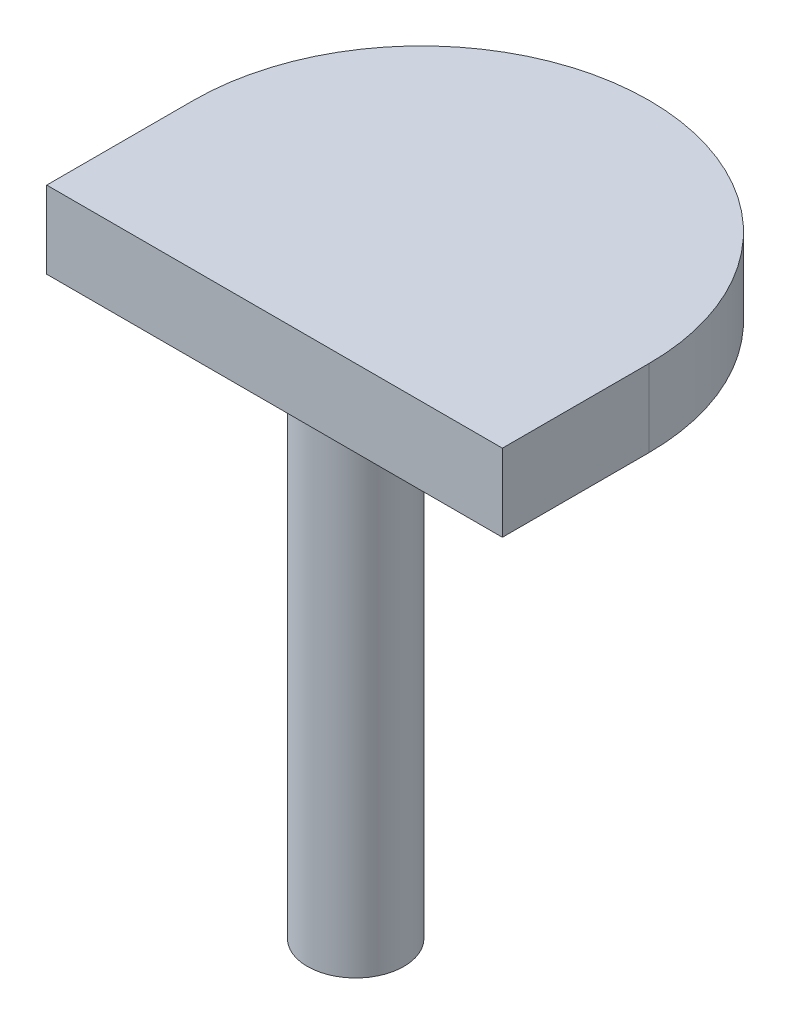
ISO-10303-21;
HEADER;
FILE_DESCRIPTION(('STEP AP214'),'2;1');
FILE_NAME('part.step','',(''),(''),'','','');
FILE_SCHEMA(('AUTOMOTIVE_DESIGN { 1 0 10303 214 1 1 1 1 }'));
ENDSEC;
DATA;
#1=APPLICATION_CONTEXT('core data for automotive mechanical design processes');
#2=APPLICATION_PROTOCOL_DEFINITION('international standard','automotive_design',2000,#1);
#3=PRODUCT_CONTEXT('',#1,'mechanical');
#4=PRODUCT('Part','Part','',(#3));
#5=PRODUCT_RELATED_PRODUCT_CATEGORY('part','',(#4));
#6=PRODUCT_DEFINITION_FORMATION('','',#4);
#7=PRODUCT_DEFINITION_CONTEXT('part definition',#1,'design');
#8=PRODUCT_DEFINITION('design','',#6,#7);
#9=PRODUCT_DEFINITION_SHAPE('','',#8);
#10=(LENGTH_UNIT() NAMED_UNIT(*) SI_UNIT(.MILLI.,.METRE.));
#11=(NAMED_UNIT(*) PLANE_ANGLE_UNIT() SI_UNIT($,.RADIAN.));
#12=(NAMED_UNIT(*) SI_UNIT($,.STERADIAN.) SOLID_ANGLE_UNIT());
#13=UNCERTAINTY_MEASURE_WITH_UNIT(LENGTH_MEASURE(1.E-05),#10,'distance_accuracy_value','');
#14=(GEOMETRIC_REPRESENTATION_CONTEXT(3) GLOBAL_UNCERTAINTY_ASSIGNED_CONTEXT((#13)) GLOBAL_UNIT_ASSIGNED_CONTEXT((#10,
#11,#12)) REPRESENTATION_CONTEXT('',''));
#15=CARTESIAN_POINT('',(0.,0.,0.));
#16=DIRECTION('',(0.,0.,1.));
#17=DIRECTION('',(1.,0.,0.));
#18=AXIS2_PLACEMENT_3D('',#15,#16,#17);
#19=CARTESIAN_POINT('',(0.,14.,0.));
#20=DIRECTION('',(0.,-1.,0.));
#21=DIRECTION('',(0.,0.,-1.));
#22=AXIS2_PLACEMENT_3D('',#19,#20,#21);
#23=CYLINDRICAL_SURFACE('',#22,1.25);
#24=CARTESIAN_POINT('',(0.,0.,0.));
#25=DIRECTION('',(0.,1.,0.));
#26=DIRECTION('',(0.,0.,1.));
#27=AXIS2_PLACEMENT_3D('',#24,#25,#26);
#28=CIRCLE('',#27,1.25);
#29=CARTESIAN_POINT('',(0.,0.,1.25));
#30=VERTEX_POINT('',#29);
#31=EDGE_CURVE('E46',#30,#30,#28,.T.);
#32=ORIENTED_EDGE('',*,*,#31,.T.);
#33=EDGE_LOOP('',(#32));
#34=FACE_BOUND('',#33,.T.);
#35=CARTESIAN_POINT('',(0.,13.,0.));
#36=DIRECTION('',(0.,1.,0.));
#37=DIRECTION('',(0.,0.,1.));
#38=AXIS2_PLACEMENT_3D('',#35,#36,#37);
#39=CIRCLE('',#38,1.25);
#40=CARTESIAN_POINT('',(0.,13.,1.25));
#41=VERTEX_POINT('',#40);
#42=EDGE_CURVE('E11',#41,#41,#39,.T.);
#43=ORIENTED_EDGE('',*,*,#42,.F.);
#44=EDGE_LOOP('',(#43));
#45=FACE_BOUND('',#44,.T.);
#46=ADVANCED_FACE('F39',(#34,#45),#23,.T.);
#47=CARTESIAN_POINT('',(0.,0.,0.));
#48=DIRECTION('',(0.,1.,0.));
#49=DIRECTION('',(0.,0.,1.));
#50=AXIS2_PLACEMENT_3D('',#47,#48,#49);
#51=PLANE('',#50);
#52=ORIENTED_EDGE('',*,*,#31,.F.);
#53=EDGE_LOOP('',(#52));
#54=FACE_BOUND('',#53,.T.);
#55=ADVANCED_FACE('F116',(#54),#51,.F.);
#56=CARTESIAN_POINT('',(5.90000000133266,13.,2.09999999999997));
#57=DIRECTION('',(1.,0.,0.));
#58=DIRECTION('',(0.,0.,-1.));
#59=AXIS2_PLACEMENT_3D('',#56,#57,#58);
#60=PLANE('',#59);
#61=DIRECTION('',(0.,1.,0.));
#62=VECTOR('',#61,1.);
#63=CARTESIAN_POINT('',(5.90000000133266,13.,-1.70000000000003));
#64=LINE('',#63,#62);
#65=CARTESIAN_POINT('',(5.90000000133266,13.,-1.70000000000003));
#66=VERTEX_POINT('',#65);
#67=CARTESIAN_POINT('',(5.90000000133266,15.,-1.70000000000003));
#68=VERTEX_POINT('',#67);
#69=EDGE_CURVE('E87',#66,#68,#64,.T.);
#70=ORIENTED_EDGE('',*,*,#69,.T.);
#71=DIRECTION('',(0.,0.,-1.));
#72=VECTOR('',#71,1.);
#73=CARTESIAN_POINT('',(5.90000000133266,15.,2.09999999999997));
#74=LINE('',#73,#72);
#75=CARTESIAN_POINT('',(5.90000000133266,15.,2.09999999999997));
#76=VERTEX_POINT('',#75);
#77=EDGE_CURVE('E90',#76,#68,#74,.T.);
#78=ORIENTED_EDGE('',*,*,#77,.F.);
#79=DIRECTION('',(0.,1.,0.));
#80=VECTOR('',#79,1.);
#81=CARTESIAN_POINT('',(5.90000000133266,13.,2.09999999999997));
#82=LINE('',#81,#80);
#83=CARTESIAN_POINT('',(5.90000000133266,13.,2.09999999999997));
#84=VERTEX_POINT('',#83);
#85=EDGE_CURVE('E53',#84,#76,#82,.T.);
#86=ORIENTED_EDGE('',*,*,#85,.F.);
#87=DIRECTION('',(0.,0.,-1.));
#88=VECTOR('',#87,1.);
#89=CARTESIAN_POINT('',(5.90000000133266,13.,2.09999999999997));
#90=LINE('',#89,#88);
#91=EDGE_CURVE('E102',#84,#66,#90,.T.);
#92=ORIENTED_EDGE('',*,*,#91,.T.);
#93=EDGE_LOOP('',(#70,#78,#86,#92));
#94=FACE_BOUND('',#93,.T.);
#95=ADVANCED_FACE('F118',(#94),#60,.T.);
#96=CARTESIAN_POINT('',(5.90000000133266,13.,2.09999999999997));
#97=DIRECTION('',(0.,0.,1.));
#98=DIRECTION('',(1.,0.,0.));
#99=AXIS2_PLACEMENT_3D('',#96,#97,#98);
#100=PLANE('',#99);
#101=ORIENTED_EDGE('',*,*,#85,.T.);
#102=DIRECTION('',(1.,0.,0.));
#103=VECTOR('',#102,1.);
#104=CARTESIAN_POINT('',(5.90000000133266,15.,2.09999999999997));
#105=LINE('',#104,#103);
#106=CARTESIAN_POINT('',(-5.89999999866734,15.,2.09999999999997));
#107=VERTEX_POINT('',#106);
#108=EDGE_CURVE('E105',#107,#76,#105,.T.);
#109=ORIENTED_EDGE('',*,*,#108,.F.);
#110=DIRECTION('',(0.,1.,0.));
#111=VECTOR('',#110,1.);
#112=CARTESIAN_POINT('',(-5.89999999866734,13.,2.09999999999997));
#113=LINE('',#112,#111);
#114=CARTESIAN_POINT('',(-5.89999999866734,13.,2.09999999999997));
#115=VERTEX_POINT('',#114);
#116=EDGE_CURVE('E61',#115,#107,#113,.T.);
#117=ORIENTED_EDGE('',*,*,#116,.F.);
#118=DIRECTION('',(1.,0.,0.));
#119=VECTOR('',#118,1.);
#120=CARTESIAN_POINT('',(5.90000000133266,13.,2.09999999999997));
#121=LINE('',#120,#119);
#122=EDGE_CURVE('E101',#115,#84,#121,.T.);
#123=ORIENTED_EDGE('',*,*,#122,.T.);
#124=EDGE_LOOP('',(#101,#109,#117,#123));
#125=FACE_BOUND('',#124,.T.);
#126=ADVANCED_FACE('F123',(#125),#100,.T.);
#127=CARTESIAN_POINT('',(-5.89999999866734,13.,2.09999999999997));
#128=DIRECTION('',(-1.,0.,0.));
#129=DIRECTION('',(0.,0.,1.));
#130=AXIS2_PLACEMENT_3D('',#127,#128,#129);
#131=PLANE('',#130);
#132=ORIENTED_EDGE('',*,*,#116,.T.);
#133=DIRECTION('',(0.,0.,1.));
#134=VECTOR('',#133,1.);
#135=CARTESIAN_POINT('',(-5.89999999866734,15.,2.09999999999997));
#136=LINE('',#135,#134);
#137=CARTESIAN_POINT('',(-5.89999999866734,15.,-1.70000000000003));
#138=VERTEX_POINT('',#137);
#139=EDGE_CURVE('E98',#138,#107,#136,.T.);
#140=ORIENTED_EDGE('',*,*,#139,.F.);
#141=DIRECTION('',(0.,1.,0.));
#142=VECTOR('',#141,1.);
#143=CARTESIAN_POINT('',(-5.89999999866734,13.,-1.70000000000003));
#144=LINE('',#143,#142);
#145=CARTESIAN_POINT('',(-5.89999999866734,13.,-1.70000000000003));
#146=VERTEX_POINT('',#145);
#147=EDGE_CURVE('E84',#146,#138,#144,.T.);
#148=ORIENTED_EDGE('',*,*,#147,.F.);
#149=DIRECTION('',(0.,0.,1.));
#150=VECTOR('',#149,1.);
#151=CARTESIAN_POINT('',(-5.89999999866734,13.,2.09999999999997));
#152=LINE('',#151,#150);
#153=EDGE_CURVE('E95',#146,#115,#152,.T.);
#154=ORIENTED_EDGE('',*,*,#153,.T.);
#155=EDGE_LOOP('',(#132,#140,#148,#154));
#156=FACE_BOUND('',#155,.T.);
#157=ADVANCED_FACE('F94',(#156),#131,.T.);
#158=CARTESIAN_POINT('',(0.,13.,0.));
#159=DIRECTION('',(0.,1.,0.));
#160=DIRECTION('',(0.,0.,1.));
#161=AXIS2_PLACEMENT_3D('',#158,#159,#160);
#162=PLANE('',#161);
#163=ORIENTED_EDGE('',*,*,#42,.T.);
#164=EDGE_LOOP('',(#163));
#165=FACE_BOUND('',#164,.T.);
#166=ORIENTED_EDGE('',*,*,#91,.F.);
#167=ORIENTED_EDGE('',*,*,#122,.F.);
#168=ORIENTED_EDGE('',*,*,#153,.F.);
#169=CARTESIAN_POINT('',(1.33265967705576E-09,13.,-1.70000000000003));
#170=DIRECTION('',(0.,1.,0.));
#171=DIRECTION('',(0.,0.,1.));
#172=AXIS2_PLACEMENT_3D('',#169,#170,#171);
#173=CIRCLE('',#172,5.9);
#174=EDGE_CURVE('E81',#66,#146,#173,.T.);
#175=ORIENTED_EDGE('',*,*,#174,.F.);
#176=EDGE_LOOP('',(#166,#167,#168,#175));
#177=FACE_BOUND('',#176,.T.);
#178=ADVANCED_FACE('F100',(#165,#177),#162,.F.);
#179=CARTESIAN_POINT('',(0.,15.,0.));
#180=DIRECTION('',(0.,1.,0.));
#181=DIRECTION('',(0.,0.,1.));
#182=AXIS2_PLACEMENT_3D('',#179,#180,#181);
#183=PLANE('',#182);
#184=ORIENTED_EDGE('',*,*,#77,.T.);
#185=CARTESIAN_POINT('',(1.33265967705576E-09,15.,-1.70000000000003));
#186=DIRECTION('',(0.,1.,0.));
#187=DIRECTION('',(0.,0.,1.));
#188=AXIS2_PLACEMENT_3D('',#185,#186,#187);
#189=CIRCLE('',#188,5.9);
#190=EDGE_CURVE('E91',#68,#138,#189,.T.);
#191=ORIENTED_EDGE('',*,*,#190,.T.);
#192=ORIENTED_EDGE('',*,*,#139,.T.);
#193=ORIENTED_EDGE('',*,*,#108,.T.);
#194=EDGE_LOOP('',(#184,#191,#192,#193));
#195=FACE_BOUND('',#194,.T.);
#196=ADVANCED_FACE('F133',(#195),#183,.T.);
#197=CARTESIAN_POINT('',(1.33265967705576E-09,13.,-1.70000000000003));
#198=DIRECTION('',(0.,1.,0.));
#199=DIRECTION('',(0.,0.,1.));
#200=AXIS2_PLACEMENT_3D('',#197,#198,#199);
#201=CYLINDRICAL_SURFACE('',#200,5.9);
#202=ORIENTED_EDGE('',*,*,#190,.F.);
#203=ORIENTED_EDGE('',*,*,#69,.F.);
#204=ORIENTED_EDGE('',*,*,#174,.T.);
#205=ORIENTED_EDGE('',*,*,#147,.T.);
#206=EDGE_LOOP('',(#202,#203,#204,#205));
#207=FACE_BOUND('',#206,.T.);
#208=ADVANCED_FACE('F83',(#207),#201,.T.);
#209=CLOSED_SHELL('',(#46,#55,#95,#126,#157,#178,#196,#208));
#210=MANIFOLD_SOLID_BREP('B2',#209);
#211=ADVANCED_BREP_SHAPE_REPRESENTATION('',(#18,#210),#14);
#212=SHAPE_DEFINITION_REPRESENTATION(#9,#211);
ENDSEC;
END-ISO-10303-21;
